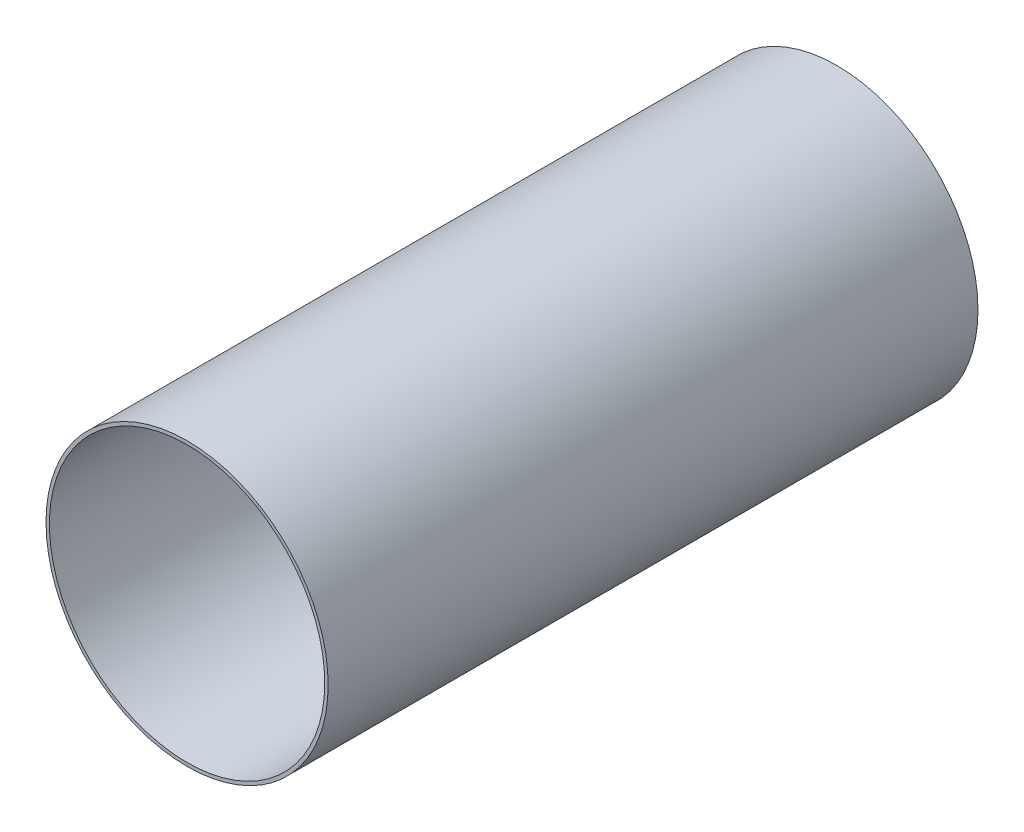
ISO-10303-21;
HEADER;
FILE_DESCRIPTION(('STEP AP214'),'2;1');
FILE_NAME('part.step','',(''),(''),'','','');
FILE_SCHEMA(('AUTOMOTIVE_DESIGN { 1 0 10303 214 1 1 1 1 }'));
ENDSEC;
DATA;
#1=APPLICATION_CONTEXT('core data for automotive mechanical design processes');
#2=APPLICATION_PROTOCOL_DEFINITION('international standard','automotive_design',2000,#1);
#3=PRODUCT_CONTEXT('',#1,'mechanical');
#4=PRODUCT('Part','Part','',(#3));
#5=PRODUCT_RELATED_PRODUCT_CATEGORY('part','',(#4));
#6=PRODUCT_DEFINITION_FORMATION('','',#4);
#7=PRODUCT_DEFINITION_CONTEXT('part definition',#1,'design');
#8=PRODUCT_DEFINITION('design','',#6,#7);
#9=PRODUCT_DEFINITION_SHAPE('','',#8);
#10=(LENGTH_UNIT() NAMED_UNIT(*) SI_UNIT(.MILLI.,.METRE.));
#11=(NAMED_UNIT(*) PLANE_ANGLE_UNIT() SI_UNIT($,.RADIAN.));
#12=(NAMED_UNIT(*) SI_UNIT($,.STERADIAN.) SOLID_ANGLE_UNIT());
#13=UNCERTAINTY_MEASURE_WITH_UNIT(LENGTH_MEASURE(1.E-05),#10,'distance_accuracy_value','');
#14=(GEOMETRIC_REPRESENTATION_CONTEXT(3) GLOBAL_UNCERTAINTY_ASSIGNED_CONTEXT((#13)) GLOBAL_UNIT_ASSIGNED_CONTEXT((#10,
#11,#12)) REPRESENTATION_CONTEXT('',''));
#15=CARTESIAN_POINT('',(0.,0.,0.));
#16=DIRECTION('',(0.,0.,1.));
#17=DIRECTION('',(1.,0.,0.));
#18=AXIS2_PLACEMENT_3D('',#15,#16,#17);
#19=CARTESIAN_POINT('',(0.,0.,380.));
#20=DIRECTION('',(0.,0.,1.));
#21=DIRECTION('',(1.,0.,0.));
#22=AXIS2_PLACEMENT_3D('',#19,#20,#21);
#23=CYLINDRICAL_SURFACE('',#22,80.5);
#24=CARTESIAN_POINT('',(0.,0.,0.));
#25=DIRECTION('',(0.,0.,1.));
#26=DIRECTION('',(1.,0.,0.));
#27=AXIS2_PLACEMENT_3D('',#24,#25,#26);
#28=CIRCLE('',#27,80.5);
#29=CARTESIAN_POINT('',(80.5,0.,0.));
#30=VERTEX_POINT('',#29);
#31=EDGE_CURVE('E27',#30,#30,#28,.F.);
#32=ORIENTED_EDGE('',*,*,#31,.T.);
#33=EDGE_LOOP('',(#32));
#34=FACE_BOUND('',#33,.T.);
#35=CARTESIAN_POINT('',(0.,0.,380.));
#36=DIRECTION('',(0.,0.,1.));
#37=DIRECTION('',(1.,0.,0.));
#38=AXIS2_PLACEMENT_3D('',#35,#36,#37);
#39=CIRCLE('',#38,80.5);
#40=CARTESIAN_POINT('',(80.5,0.,380.));
#41=VERTEX_POINT('',#40);
#42=EDGE_CURVE('E18',#41,#41,#39,.F.);
#43=ORIENTED_EDGE('',*,*,#42,.F.);
#44=EDGE_LOOP('',(#43));
#45=FACE_BOUND('',#44,.T.);
#46=ADVANCED_FACE('F15',(#34,#45),#23,.F.);
#47=CARTESIAN_POINT('',(0.,0.,380.));
#48=DIRECTION('',(0.,0.,1.));
#49=DIRECTION('',(1.,0.,0.));
#50=AXIS2_PLACEMENT_3D('',#47,#48,#49);
#51=PLANE('',#50);
#52=CARTESIAN_POINT('',(0.,0.,380.));
#53=DIRECTION('',(0.,0.,1.));
#54=DIRECTION('',(1.,0.,0.));
#55=AXIS2_PLACEMENT_3D('',#52,#53,#54);
#56=CIRCLE('',#55,82.5);
#57=CARTESIAN_POINT('',(82.5,0.,380.));
#58=VERTEX_POINT('',#57);
#59=EDGE_CURVE('E22',#58,#58,#56,.F.);
#60=ORIENTED_EDGE('',*,*,#59,.F.);
#61=EDGE_LOOP('',(#60));
#62=FACE_BOUND('',#61,.T.);
#63=ORIENTED_EDGE('',*,*,#42,.T.);
#64=EDGE_LOOP('',(#63));
#65=FACE_BOUND('',#64,.T.);
#66=ADVANCED_FACE('F35',(#62,#65),#51,.T.);
#67=CARTESIAN_POINT('',(0.,0.,0.));
#68=DIRECTION('',(0.,0.,1.));
#69=DIRECTION('',(1.,0.,0.));
#70=AXIS2_PLACEMENT_3D('',#67,#68,#69);
#71=PLANE('',#70);
#72=CARTESIAN_POINT('',(0.,0.,0.));
#73=DIRECTION('',(0.,0.,1.));
#74=DIRECTION('',(1.,0.,0.));
#75=AXIS2_PLACEMENT_3D('',#72,#73,#74);
#76=CIRCLE('',#75,82.5);
#77=CARTESIAN_POINT('',(82.5,0.,0.));
#78=VERTEX_POINT('',#77);
#79=EDGE_CURVE('E10',#78,#78,#76,.T.);
#80=ORIENTED_EDGE('',*,*,#79,.F.);
#81=EDGE_LOOP('',(#80));
#82=FACE_BOUND('',#81,.T.);
#83=ORIENTED_EDGE('',*,*,#31,.F.);
#84=EDGE_LOOP('',(#83));
#85=FACE_BOUND('',#84,.T.);
#86=ADVANCED_FACE('F42',(#82,#85),#71,.F.);
#87=CARTESIAN_POINT('',(0.,0.,380.));
#88=DIRECTION('',(0.,0.,1.));
#89=DIRECTION('',(1.,0.,0.));
#90=AXIS2_PLACEMENT_3D('',#87,#88,#89);
#91=CYLINDRICAL_SURFACE('',#90,82.5);
#92=ORIENTED_EDGE('',*,*,#79,.T.);
#93=EDGE_LOOP('',(#92));
#94=FACE_BOUND('',#93,.T.);
#95=ORIENTED_EDGE('',*,*,#59,.T.);
#96=EDGE_LOOP('',(#95));
#97=FACE_BOUND('',#96,.T.);
#98=ADVANCED_FACE('F44',(#94,#97),#91,.T.);
#99=CLOSED_SHELL('',(#46,#66,#86,#98));
#100=MANIFOLD_SOLID_BREP('B1',#99);
#101=ADVANCED_BREP_SHAPE_REPRESENTATION('',(#18,#100),#14);
#102=SHAPE_DEFINITION_REPRESENTATION(#9,#101);
ENDSEC;
END-ISO-10303-21;
